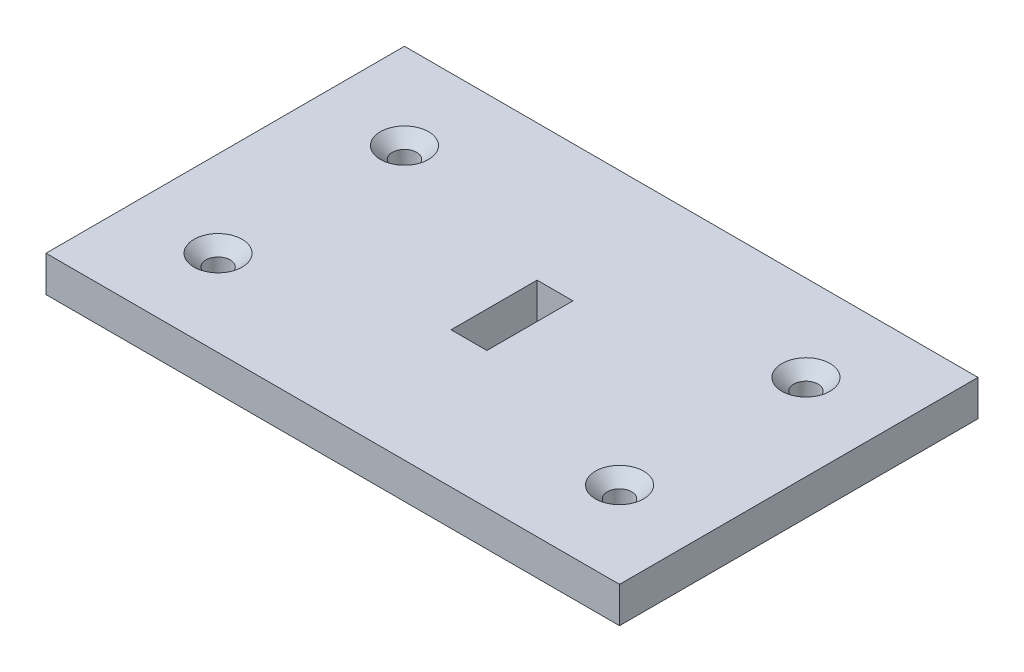
ISO-10303-21;
HEADER;
FILE_DESCRIPTION(('STEP AP214'),'2;1');
FILE_NAME('part.step','',(''),(''),'','','');
FILE_SCHEMA(('AUTOMOTIVE_DESIGN { 1 0 10303 214 1 1 1 1 }'));
ENDSEC;
DATA;
#1=APPLICATION_CONTEXT('core data for automotive mechanical design processes');
#2=APPLICATION_PROTOCOL_DEFINITION('international standard','automotive_design',2000,#1);
#3=PRODUCT_CONTEXT('',#1,'mechanical');
#4=PRODUCT('Part','Part','',(#3));
#5=PRODUCT_RELATED_PRODUCT_CATEGORY('part','',(#4));
#6=PRODUCT_DEFINITION_FORMATION('','',#4);
#7=PRODUCT_DEFINITION_CONTEXT('part definition',#1,'design');
#8=PRODUCT_DEFINITION('design','',#6,#7);
#9=PRODUCT_DEFINITION_SHAPE('','',#8);
#10=(LENGTH_UNIT() NAMED_UNIT(*) SI_UNIT(.MILLI.,.METRE.));
#11=(NAMED_UNIT(*) PLANE_ANGLE_UNIT() SI_UNIT($,.RADIAN.));
#12=(NAMED_UNIT(*) SI_UNIT($,.STERADIAN.) SOLID_ANGLE_UNIT());
#13=UNCERTAINTY_MEASURE_WITH_UNIT(LENGTH_MEASURE(1.E-05),#10,'distance_accuracy_value','');
#14=(GEOMETRIC_REPRESENTATION_CONTEXT(3) GLOBAL_UNCERTAINTY_ASSIGNED_CONTEXT((#13)) GLOBAL_UNIT_ASSIGNED_CONTEXT((#10,
#11,#12)) REPRESENTATION_CONTEXT('',''));
#15=CARTESIAN_POINT('',(0.,0.,0.));
#16=DIRECTION('',(0.,0.,1.));
#17=DIRECTION('',(1.,0.,0.));
#18=AXIS2_PLACEMENT_3D('',#15,#16,#17);
#19=CARTESIAN_POINT('',(40.,2.5,25.));
#20=DIRECTION('',(-1.,0.,0.));
#21=DIRECTION('',(0.,0.,1.));
#22=AXIS2_PLACEMENT_3D('',#19,#20,#21);
#23=PLANE('',#22);
#24=DIRECTION('',(0.,0.,-1.));
#25=VECTOR('',#24,1.);
#26=CARTESIAN_POINT('',(40.,-2.5,25.));
#27=LINE('',#26,#25);
#28=CARTESIAN_POINT('',(40.,-2.5,25.));
#29=VERTEX_POINT('',#28);
#30=CARTESIAN_POINT('',(40.,-2.5,-25.));
#31=VERTEX_POINT('',#30);
#32=EDGE_CURVE('E134',#29,#31,#27,.T.);
#33=ORIENTED_EDGE('',*,*,#32,.T.);
#34=DIRECTION('',(0.,-1.,0.));
#35=VECTOR('',#34,1.);
#36=CARTESIAN_POINT('',(40.,2.5,-25.));
#37=LINE('',#36,#35);
#38=CARTESIAN_POINT('',(40.,2.5,-25.));
#39=VERTEX_POINT('',#38);
#40=EDGE_CURVE('E11',#39,#31,#37,.T.);
#41=ORIENTED_EDGE('',*,*,#40,.F.);
#42=DIRECTION('',(0.,0.,-1.));
#43=VECTOR('',#42,1.);
#44=CARTESIAN_POINT('',(40.,2.5,25.));
#45=LINE('',#44,#43);
#46=CARTESIAN_POINT('',(40.,2.5,25.));
#47=VERTEX_POINT('',#46);
#48=EDGE_CURVE('E138',#47,#39,#45,.T.);
#49=ORIENTED_EDGE('',*,*,#48,.F.);
#50=DIRECTION('',(0.,-1.,0.));
#51=VECTOR('',#50,1.);
#52=CARTESIAN_POINT('',(40.,2.5,25.));
#53=LINE('',#52,#51);
#54=EDGE_CURVE('E150',#47,#29,#53,.T.);
#55=ORIENTED_EDGE('',*,*,#54,.T.);
#56=EDGE_LOOP('',(#33,#41,#49,#55));
#57=FACE_BOUND('',#56,.T.);
#58=ADVANCED_FACE('F34',(#57),#23,.F.);
#59=CARTESIAN_POINT('',(40.,2.5,-25.));
#60=DIRECTION('',(0.,0.,1.));
#61=DIRECTION('',(1.,0.,0.));
#62=AXIS2_PLACEMENT_3D('',#59,#60,#61);
#63=PLANE('',#62);
#64=DIRECTION('',(-1.,0.,0.));
#65=VECTOR('',#64,1.);
#66=CARTESIAN_POINT('',(40.,-2.5,-25.));
#67=LINE('',#66,#65);
#68=CARTESIAN_POINT('',(-40.,-2.5,-25.));
#69=VERTEX_POINT('',#68);
#70=EDGE_CURVE('E153',#31,#69,#67,.T.);
#71=ORIENTED_EDGE('',*,*,#70,.T.);
#72=DIRECTION('',(0.,-1.,0.));
#73=VECTOR('',#72,1.);
#74=CARTESIAN_POINT('',(-40.,2.5,-25.));
#75=LINE('',#74,#73);
#76=CARTESIAN_POINT('',(-40.,2.5,-25.));
#77=VERTEX_POINT('',#76);
#78=EDGE_CURVE('E41',#77,#69,#75,.T.);
#79=ORIENTED_EDGE('',*,*,#78,.F.);
#80=DIRECTION('',(-1.,0.,0.));
#81=VECTOR('',#80,1.);
#82=CARTESIAN_POINT('',(40.,2.5,-25.));
#83=LINE('',#82,#81);
#84=EDGE_CURVE('E141',#39,#77,#83,.T.);
#85=ORIENTED_EDGE('',*,*,#84,.F.);
#86=ORIENTED_EDGE('',*,*,#40,.T.);
#87=EDGE_LOOP('',(#71,#79,#85,#86));
#88=FACE_BOUND('',#87,.T.);
#89=ADVANCED_FACE('F169',(#88),#63,.F.);
#90=CARTESIAN_POINT('',(-40.,2.5,25.));
#91=DIRECTION('',(-1.,0.,0.));
#92=DIRECTION('',(0.,0.,1.));
#93=AXIS2_PLACEMENT_3D('',#90,#91,#92);
#94=PLANE('',#93);
#95=DIRECTION('',(0.,0.,-1.));
#96=VECTOR('',#95,1.);
#97=CARTESIAN_POINT('',(-40.,-2.5,25.));
#98=LINE('',#97,#96);
#99=CARTESIAN_POINT('',(-40.,-2.5,25.));
#100=VERTEX_POINT('',#99);
#101=EDGE_CURVE('E156',#100,#69,#98,.T.);
#102=ORIENTED_EDGE('',*,*,#101,.F.);
#103=DIRECTION('',(0.,-1.,0.));
#104=VECTOR('',#103,1.);
#105=CARTESIAN_POINT('',(-40.,2.5,25.));
#106=LINE('',#105,#104);
#107=CARTESIAN_POINT('',(-40.,2.5,25.));
#108=VERTEX_POINT('',#107);
#109=EDGE_CURVE('E162',#108,#100,#106,.T.);
#110=ORIENTED_EDGE('',*,*,#109,.F.);
#111=DIRECTION('',(0.,0.,-1.));
#112=VECTOR('',#111,1.);
#113=CARTESIAN_POINT('',(-40.,2.5,25.));
#114=LINE('',#113,#112);
#115=EDGE_CURVE('E144',#108,#77,#114,.T.);
#116=ORIENTED_EDGE('',*,*,#115,.T.);
#117=ORIENTED_EDGE('',*,*,#78,.T.);
#118=EDGE_LOOP('',(#102,#110,#116,#117));
#119=FACE_BOUND('',#118,.T.);
#120=ADVANCED_FACE('F166',(#119),#94,.T.);
#121=CARTESIAN_POINT('',(40.,2.5,25.));
#122=DIRECTION('',(0.,0.,1.));
#123=DIRECTION('',(1.,0.,0.));
#124=AXIS2_PLACEMENT_3D('',#121,#122,#123);
#125=PLANE('',#124);
#126=DIRECTION('',(-1.,0.,0.));
#127=VECTOR('',#126,1.);
#128=CARTESIAN_POINT('',(40.,-2.5,25.));
#129=LINE('',#128,#127);
#130=EDGE_CURVE('E142',#29,#100,#129,.T.);
#131=ORIENTED_EDGE('',*,*,#130,.F.);
#132=ORIENTED_EDGE('',*,*,#54,.F.);
#133=DIRECTION('',(-1.,0.,0.));
#134=VECTOR('',#133,1.);
#135=CARTESIAN_POINT('',(40.,2.5,25.));
#136=LINE('',#135,#134);
#137=EDGE_CURVE('E147',#47,#108,#136,.T.);
#138=ORIENTED_EDGE('',*,*,#137,.T.);
#139=ORIENTED_EDGE('',*,*,#109,.T.);
#140=EDGE_LOOP('',(#131,#132,#138,#139));
#141=FACE_BOUND('',#140,.T.);
#142=ADVANCED_FACE('F174',(#141),#125,.T.);
#143=CARTESIAN_POINT('',(0.,2.5,0.));
#144=DIRECTION('',(0.,1.,0.));
#145=DIRECTION('',(0.,0.,1.));
#146=AXIS2_PLACEMENT_3D('',#143,#144,#145);
#147=PLANE('',#146);
#148=CARTESIAN_POINT('',(28.,2.5,13.));
#149=DIRECTION('',(0.,1.,0.));
#150=DIRECTION('',(0.,0.,1.));
#151=AXIS2_PLACEMENT_3D('',#148,#149,#150);
#152=CIRCLE('',#151,3.36);
#153=CARTESIAN_POINT('',(28.,2.5,16.36));
#154=VERTEX_POINT('',#153);
#155=EDGE_CURVE('E247',#154,#154,#152,.T.);
#156=ORIENTED_EDGE('',*,*,#155,.F.);
#157=EDGE_LOOP('',(#156));
#158=FACE_BOUND('',#157,.T.);
#159=CARTESIAN_POINT('',(28.,2.5,-13.));
#160=DIRECTION('',(0.,1.,0.));
#161=DIRECTION('',(0.,0.,1.));
#162=AXIS2_PLACEMENT_3D('',#159,#160,#161);
#163=CIRCLE('',#162,3.36);
#164=CARTESIAN_POINT('',(28.,2.5,-9.64));
#165=VERTEX_POINT('',#164);
#166=EDGE_CURVE('E254',#165,#165,#163,.T.);
#167=ORIENTED_EDGE('',*,*,#166,.F.);
#168=EDGE_LOOP('',(#167));
#169=FACE_BOUND('',#168,.T.);
#170=CARTESIAN_POINT('',(-28.,2.5,13.));
#171=DIRECTION('',(0.,1.,0.));
#172=DIRECTION('',(0.,0.,1.));
#173=AXIS2_PLACEMENT_3D('',#170,#171,#172);
#174=CIRCLE('',#173,3.36);
#175=CARTESIAN_POINT('',(-28.,2.5,16.36));
#176=VERTEX_POINT('',#175);
#177=EDGE_CURVE('E263',#176,#176,#174,.T.);
#178=ORIENTED_EDGE('',*,*,#177,.F.);
#179=EDGE_LOOP('',(#178));
#180=FACE_BOUND('',#179,.T.);
#181=CARTESIAN_POINT('',(-28.,2.5,-13.));
#182=DIRECTION('',(0.,1.,0.));
#183=DIRECTION('',(0.,0.,1.));
#184=AXIS2_PLACEMENT_3D('',#181,#182,#183);
#185=CIRCLE('',#184,3.36);
#186=CARTESIAN_POINT('',(-28.,2.5,-9.64));
#187=VERTEX_POINT('',#186);
#188=EDGE_CURVE('E272',#187,#187,#185,.T.);
#189=ORIENTED_EDGE('',*,*,#188,.F.);
#190=EDGE_LOOP('',(#189));
#191=FACE_BOUND('',#190,.T.);
#192=DIRECTION('',(0.,0.,1.));
#193=VECTOR('',#192,1.);
#194=CARTESIAN_POINT('',(-2.5,2.5,6.));
#195=LINE('',#194,#193);
#196=CARTESIAN_POINT('',(-2.5,2.5,-6.));
#197=VERTEX_POINT('',#196);
#198=CARTESIAN_POINT('',(-2.5,2.5,6.));
#199=VERTEX_POINT('',#198);
#200=EDGE_CURVE('E48',#197,#199,#195,.T.);
#201=ORIENTED_EDGE('',*,*,#200,.F.);
#202=DIRECTION('',(-1.,0.,0.));
#203=VECTOR('',#202,1.);
#204=CARTESIAN_POINT('',(2.5,2.5,-6.));
#205=LINE('',#204,#203);
#206=CARTESIAN_POINT('',(2.5,2.5,-6.));
#207=VERTEX_POINT('',#206);
#208=EDGE_CURVE('E116',#207,#197,#205,.T.);
#209=ORIENTED_EDGE('',*,*,#208,.F.);
#210=DIRECTION('',(0.,0.,-1.));
#211=VECTOR('',#210,1.);
#212=CARTESIAN_POINT('',(2.5,2.5,6.));
#213=LINE('',#212,#211);
#214=CARTESIAN_POINT('',(2.5,2.5,6.));
#215=VERTEX_POINT('',#214);
#216=EDGE_CURVE('E119',#215,#207,#213,.T.);
#217=ORIENTED_EDGE('',*,*,#216,.F.);
#218=DIRECTION('',(1.,0.,0.));
#219=VECTOR('',#218,1.);
#220=CARTESIAN_POINT('',(2.5,2.5,6.));
#221=LINE('',#220,#219);
#222=EDGE_CURVE('E128',#199,#215,#221,.T.);
#223=ORIENTED_EDGE('',*,*,#222,.F.);
#224=EDGE_LOOP('',(#201,#209,#217,#223));
#225=FACE_BOUND('',#224,.T.);
#226=ORIENTED_EDGE('',*,*,#48,.T.);
#227=ORIENTED_EDGE('',*,*,#84,.T.);
#228=ORIENTED_EDGE('',*,*,#115,.F.);
#229=ORIENTED_EDGE('',*,*,#137,.F.);
#230=EDGE_LOOP('',(#226,#227,#228,#229));
#231=FACE_BOUND('',#230,.T.);
#232=ADVANCED_FACE('F178',(#158,#169,#180,#191,#225,#231),#147,.T.);
#233=CARTESIAN_POINT('',(0.,-2.5,0.));
#234=DIRECTION('',(0.,1.,0.));
#235=DIRECTION('',(0.,0.,1.));
#236=AXIS2_PLACEMENT_3D('',#233,#234,#235);
#237=PLANE('',#236);
#238=CARTESIAN_POINT('',(28.,-2.5,13.));
#239=DIRECTION('',(0.,1.,0.));
#240=DIRECTION('',(0.,0.,1.));
#241=AXIS2_PLACEMENT_3D('',#238,#239,#240);
#242=CIRCLE('',#241,1.7);
#243=CARTESIAN_POINT('',(28.,-2.5,14.7));
#244=VERTEX_POINT('',#243);
#245=EDGE_CURVE('E249',#244,#244,#242,.T.);
#246=ORIENTED_EDGE('',*,*,#245,.T.);
#247=EDGE_LOOP('',(#246));
#248=FACE_BOUND('',#247,.T.);
#249=CARTESIAN_POINT('',(28.,-2.5,-13.));
#250=DIRECTION('',(0.,1.,0.));
#251=DIRECTION('',(0.,0.,1.));
#252=AXIS2_PLACEMENT_3D('',#249,#250,#251);
#253=CIRCLE('',#252,1.7);
#254=CARTESIAN_POINT('',(28.,-2.5,-11.3));
#255=VERTEX_POINT('',#254);
#256=EDGE_CURVE('E260',#255,#255,#253,.T.);
#257=ORIENTED_EDGE('',*,*,#256,.T.);
#258=EDGE_LOOP('',(#257));
#259=FACE_BOUND('',#258,.T.);
#260=CARTESIAN_POINT('',(-28.,-2.5,13.));
#261=DIRECTION('',(0.,1.,0.));
#262=DIRECTION('',(0.,0.,1.));
#263=AXIS2_PLACEMENT_3D('',#260,#261,#262);
#264=CIRCLE('',#263,1.7);
#265=CARTESIAN_POINT('',(-28.,-2.5,14.7));
#266=VERTEX_POINT('',#265);
#267=EDGE_CURVE('E269',#266,#266,#264,.T.);
#268=ORIENTED_EDGE('',*,*,#267,.T.);
#269=EDGE_LOOP('',(#268));
#270=FACE_BOUND('',#269,.T.);
#271=CARTESIAN_POINT('',(-28.,-2.5,-13.));
#272=DIRECTION('',(0.,1.,0.));
#273=DIRECTION('',(0.,0.,1.));
#274=AXIS2_PLACEMENT_3D('',#271,#272,#273);
#275=CIRCLE('',#274,1.7);
#276=CARTESIAN_POINT('',(-28.,-2.5,-11.3));
#277=VERTEX_POINT('',#276);
#278=EDGE_CURVE('E122',#277,#277,#275,.T.);
#279=ORIENTED_EDGE('',*,*,#278,.T.);
#280=EDGE_LOOP('',(#279));
#281=FACE_BOUND('',#280,.T.);
#282=DIRECTION('',(-1.,0.,0.));
#283=VECTOR('',#282,1.);
#284=CARTESIAN_POINT('',(2.5,-2.5,-6.));
#285=LINE('',#284,#283);
#286=CARTESIAN_POINT('',(2.5,-2.5,-6.));
#287=VERTEX_POINT('',#286);
#288=CARTESIAN_POINT('',(-2.5,-2.5,-6.));
#289=VERTEX_POINT('',#288);
#290=EDGE_CURVE('E106',#287,#289,#285,.T.);
#291=ORIENTED_EDGE('',*,*,#290,.T.);
#292=DIRECTION('',(0.,0.,1.));
#293=VECTOR('',#292,1.);
#294=CARTESIAN_POINT('',(-2.5,-2.5,6.));
#295=LINE('',#294,#293);
#296=CARTESIAN_POINT('',(-2.5,-2.5,6.));
#297=VERTEX_POINT('',#296);
#298=EDGE_CURVE('E100',#289,#297,#295,.T.);
#299=ORIENTED_EDGE('',*,*,#298,.T.);
#300=DIRECTION('',(1.,0.,0.));
#301=VECTOR('',#300,1.);
#302=CARTESIAN_POINT('',(2.5,-2.5,6.));
#303=LINE('',#302,#301);
#304=CARTESIAN_POINT('',(2.5,-2.5,6.));
#305=VERTEX_POINT('',#304);
#306=EDGE_CURVE('E109',#297,#305,#303,.T.);
#307=ORIENTED_EDGE('',*,*,#306,.T.);
#308=DIRECTION('',(0.,0.,-1.));
#309=VECTOR('',#308,1.);
#310=CARTESIAN_POINT('',(2.5,-2.5,6.));
#311=LINE('',#310,#309);
#312=EDGE_CURVE('E56',#305,#287,#311,.T.);
#313=ORIENTED_EDGE('',*,*,#312,.T.);
#314=EDGE_LOOP('',(#291,#299,#307,#313));
#315=FACE_BOUND('',#314,.T.);
#316=ORIENTED_EDGE('',*,*,#32,.F.);
#317=ORIENTED_EDGE('',*,*,#130,.T.);
#318=ORIENTED_EDGE('',*,*,#101,.T.);
#319=ORIENTED_EDGE('',*,*,#70,.F.);
#320=EDGE_LOOP('',(#316,#317,#318,#319));
#321=FACE_BOUND('',#320,.T.);
#322=ADVANCED_FACE('F113',(#248,#259,#270,#281,#315,#321),#237,.F.);
#323=CARTESIAN_POINT('',(-2.5,-2.5,6.));
#324=DIRECTION('',(-1.,0.,0.));
#325=DIRECTION('',(0.,0.,1.));
#326=AXIS2_PLACEMENT_3D('',#323,#324,#325);
#327=PLANE('',#326);
#328=ORIENTED_EDGE('',*,*,#200,.T.);
#329=DIRECTION('',(0.,1.,0.));
#330=VECTOR('',#329,1.);
#331=CARTESIAN_POINT('',(-2.5,-2.5,6.));
#332=LINE('',#331,#330);
#333=EDGE_CURVE('E96',#297,#199,#332,.T.);
#334=ORIENTED_EDGE('',*,*,#333,.F.);
#335=ORIENTED_EDGE('',*,*,#298,.F.);
#336=DIRECTION('',(0.,1.,0.));
#337=VECTOR('',#336,1.);
#338=CARTESIAN_POINT('',(-2.5,-2.5,-6.));
#339=LINE('',#338,#337);
#340=EDGE_CURVE('E132',#289,#197,#339,.T.);
#341=ORIENTED_EDGE('',*,*,#340,.T.);
#342=EDGE_LOOP('',(#328,#334,#335,#341));
#343=FACE_BOUND('',#342,.T.);
#344=ADVANCED_FACE('F98',(#343),#327,.F.);
#345=CARTESIAN_POINT('',(2.5,-2.5,-6.));
#346=DIRECTION('',(0.,0.,-1.));
#347=DIRECTION('',(-1.,0.,0.));
#348=AXIS2_PLACEMENT_3D('',#345,#346,#347);
#349=PLANE('',#348);
#350=ORIENTED_EDGE('',*,*,#208,.T.);
#351=ORIENTED_EDGE('',*,*,#340,.F.);
#352=ORIENTED_EDGE('',*,*,#290,.F.);
#353=DIRECTION('',(0.,1.,0.));
#354=VECTOR('',#353,1.);
#355=CARTESIAN_POINT('',(2.5,-2.5,-6.));
#356=LINE('',#355,#354);
#357=EDGE_CURVE('E135',#287,#207,#356,.T.);
#358=ORIENTED_EDGE('',*,*,#357,.T.);
#359=EDGE_LOOP('',(#350,#351,#352,#358));
#360=FACE_BOUND('',#359,.T.);
#361=ADVANCED_FACE('F199',(#360),#349,.F.);
#362=CARTESIAN_POINT('',(2.5,-2.5,6.));
#363=DIRECTION('',(1.,0.,0.));
#364=DIRECTION('',(0.,0.,-1.));
#365=AXIS2_PLACEMENT_3D('',#362,#363,#364);
#366=PLANE('',#365);
#367=ORIENTED_EDGE('',*,*,#216,.T.);
#368=ORIENTED_EDGE('',*,*,#357,.F.);
#369=ORIENTED_EDGE('',*,*,#312,.F.);
#370=DIRECTION('',(0.,1.,0.));
#371=VECTOR('',#370,1.);
#372=CARTESIAN_POINT('',(2.5,-2.5,6.));
#373=LINE('',#372,#371);
#374=EDGE_CURVE('E105',#305,#215,#373,.T.);
#375=ORIENTED_EDGE('',*,*,#374,.T.);
#376=EDGE_LOOP('',(#367,#368,#369,#375));
#377=FACE_BOUND('',#376,.T.);
#378=ADVANCED_FACE('F203',(#377),#366,.F.);
#379=CARTESIAN_POINT('',(2.5,-2.5,6.));
#380=DIRECTION('',(0.,0.,1.));
#381=DIRECTION('',(1.,0.,0.));
#382=AXIS2_PLACEMENT_3D('',#379,#380,#381);
#383=PLANE('',#382);
#384=ORIENTED_EDGE('',*,*,#222,.T.);
#385=ORIENTED_EDGE('',*,*,#374,.F.);
#386=ORIENTED_EDGE('',*,*,#306,.F.);
#387=ORIENTED_EDGE('',*,*,#333,.T.);
#388=EDGE_LOOP('',(#384,#385,#386,#387));
#389=FACE_BOUND('',#388,.T.);
#390=ADVANCED_FACE('F110',(#389),#383,.F.);
#391=CARTESIAN_POINT('',(-28.,2.5,-13.));
#392=DIRECTION('',(0.,1.,0.));
#393=DIRECTION('',(0.,0.,1.));
#394=AXIS2_PLACEMENT_3D('',#391,#392,#393);
#395=CYLINDRICAL_SURFACE('',#394,1.7);
#396=ORIENTED_EDGE('',*,*,#278,.F.);
#397=EDGE_LOOP('',(#396));
#398=FACE_BOUND('',#397,.T.);
#399=CARTESIAN_POINT('',(-28.,0.84,-13.));
#400=DIRECTION('',(0.,1.,0.));
#401=DIRECTION('',(0.,0.,1.));
#402=AXIS2_PLACEMENT_3D('',#399,#400,#401);
#403=CIRCLE('',#402,1.7);
#404=CARTESIAN_POINT('',(-28.,0.84,-11.3));
#405=VERTEX_POINT('',#404);
#406=EDGE_CURVE('E274',#405,#405,#403,.T.);
#407=ORIENTED_EDGE('',*,*,#406,.T.);
#408=EDGE_LOOP('',(#407));
#409=FACE_BOUND('',#408,.T.);
#410=ADVANCED_FACE('F202',(#398,#409),#395,.F.);
#411=CARTESIAN_POINT('',(-28.,2.5,-13.));
#412=DIRECTION('',(0.,1.,0.));
#413=DIRECTION('',(0.,0.,1.));
#414=AXIS2_PLACEMENT_3D('',#411,#412,#413);
#415=CONICAL_SURFACE('',#414,3.36,0.785398163397448);
#416=ORIENTED_EDGE('',*,*,#406,.F.);
#417=EDGE_LOOP('',(#416));
#418=FACE_BOUND('',#417,.T.);
#419=ORIENTED_EDGE('',*,*,#188,.T.);
#420=EDGE_LOOP('',(#419));
#421=FACE_BOUND('',#420,.T.);
#422=ADVANCED_FACE('F211',(#418,#421),#415,.F.);
#423=CARTESIAN_POINT('',(-28.,2.5,13.));
#424=DIRECTION('',(0.,1.,0.));
#425=DIRECTION('',(0.,0.,1.));
#426=AXIS2_PLACEMENT_3D('',#423,#424,#425);
#427=CYLINDRICAL_SURFACE('',#426,1.7);
#428=ORIENTED_EDGE('',*,*,#267,.F.);
#429=EDGE_LOOP('',(#428));
#430=FACE_BOUND('',#429,.T.);
#431=CARTESIAN_POINT('',(-28.,0.84,13.));
#432=DIRECTION('',(0.,1.,0.));
#433=DIRECTION('',(0.,0.,1.));
#434=AXIS2_PLACEMENT_3D('',#431,#432,#433);
#435=CIRCLE('',#434,1.7);
#436=CARTESIAN_POINT('',(-28.,0.84,14.7));
#437=VERTEX_POINT('',#436);
#438=EDGE_CURVE('E266',#437,#437,#435,.T.);
#439=ORIENTED_EDGE('',*,*,#438,.T.);
#440=EDGE_LOOP('',(#439));
#441=FACE_BOUND('',#440,.T.);
#442=ADVANCED_FACE('F215',(#430,#441),#427,.F.);
#443=CARTESIAN_POINT('',(-28.,2.5,13.));
#444=DIRECTION('',(0.,1.,0.));
#445=DIRECTION('',(0.,0.,1.));
#446=AXIS2_PLACEMENT_3D('',#443,#444,#445);
#447=CONICAL_SURFACE('',#446,3.36,0.785398163397448);
#448=ORIENTED_EDGE('',*,*,#438,.F.);
#449=EDGE_LOOP('',(#448));
#450=FACE_BOUND('',#449,.T.);
#451=ORIENTED_EDGE('',*,*,#177,.T.);
#452=EDGE_LOOP('',(#451));
#453=FACE_BOUND('',#452,.T.);
#454=ADVANCED_FACE('F219',(#450,#453),#447,.F.);
#455=CARTESIAN_POINT('',(28.,2.5,-13.));
#456=DIRECTION('',(0.,1.,0.));
#457=DIRECTION('',(0.,0.,1.));
#458=AXIS2_PLACEMENT_3D('',#455,#456,#457);
#459=CYLINDRICAL_SURFACE('',#458,1.7);
#460=ORIENTED_EDGE('',*,*,#256,.F.);
#461=EDGE_LOOP('',(#460));
#462=FACE_BOUND('',#461,.T.);
#463=CARTESIAN_POINT('',(28.,0.84,-13.));
#464=DIRECTION('',(0.,1.,0.));
#465=DIRECTION('',(0.,0.,1.));
#466=AXIS2_PLACEMENT_3D('',#463,#464,#465);
#467=CIRCLE('',#466,1.7);
#468=CARTESIAN_POINT('',(28.,0.84,-11.3));
#469=VERTEX_POINT('',#468);
#470=EDGE_CURVE('E257',#469,#469,#467,.T.);
#471=ORIENTED_EDGE('',*,*,#470,.T.);
#472=EDGE_LOOP('',(#471));
#473=FACE_BOUND('',#472,.T.);
#474=ADVANCED_FACE('F223',(#462,#473),#459,.F.);
#475=CARTESIAN_POINT('',(28.,2.5,-13.));
#476=DIRECTION('',(0.,1.,0.));
#477=DIRECTION('',(0.,0.,1.));
#478=AXIS2_PLACEMENT_3D('',#475,#476,#477);
#479=CONICAL_SURFACE('',#478,3.36,0.785398163397448);
#480=ORIENTED_EDGE('',*,*,#470,.F.);
#481=EDGE_LOOP('',(#480));
#482=FACE_BOUND('',#481,.T.);
#483=ORIENTED_EDGE('',*,*,#166,.T.);
#484=EDGE_LOOP('',(#483));
#485=FACE_BOUND('',#484,.T.);
#486=ADVANCED_FACE('F227',(#482,#485),#479,.F.);
#487=CARTESIAN_POINT('',(28.,2.5,13.));
#488=DIRECTION('',(0.,1.,0.));
#489=DIRECTION('',(0.,0.,1.));
#490=AXIS2_PLACEMENT_3D('',#487,#488,#489);
#491=CYLINDRICAL_SURFACE('',#490,1.7);
#492=ORIENTED_EDGE('',*,*,#245,.F.);
#493=EDGE_LOOP('',(#492));
#494=FACE_BOUND('',#493,.T.);
#495=CARTESIAN_POINT('',(28.,0.84,13.));
#496=DIRECTION('',(0.,1.,0.));
#497=DIRECTION('',(0.,0.,1.));
#498=AXIS2_PLACEMENT_3D('',#495,#496,#497);
#499=CIRCLE('',#498,1.7);
#500=CARTESIAN_POINT('',(28.,0.84,14.7));
#501=VERTEX_POINT('',#500);
#502=EDGE_CURVE('E244',#501,#501,#499,.T.);
#503=ORIENTED_EDGE('',*,*,#502,.T.);
#504=EDGE_LOOP('',(#503));
#505=FACE_BOUND('',#504,.T.);
#506=ADVANCED_FACE('F231',(#494,#505),#491,.F.);
#507=CARTESIAN_POINT('',(28.,2.5,13.));
#508=DIRECTION('',(0.,1.,0.));
#509=DIRECTION('',(0.,0.,1.));
#510=AXIS2_PLACEMENT_3D('',#507,#508,#509);
#511=CONICAL_SURFACE('',#510,3.36,0.785398163397448);
#512=ORIENTED_EDGE('',*,*,#502,.F.);
#513=EDGE_LOOP('',(#512));
#514=FACE_BOUND('',#513,.T.);
#515=ORIENTED_EDGE('',*,*,#155,.T.);
#516=EDGE_LOOP('',(#515));
#517=FACE_BOUND('',#516,.T.);
#518=ADVANCED_FACE('F235',(#514,#517),#511,.F.);
#519=CLOSED_SHELL('',(#58,#89,#120,#142,#232,#322,#344,#361,#378,#390,#410,#422,#442,#454,#474,
#486,#506,#518));
#520=MANIFOLD_SOLID_BREP('B2',#519);
#521=ADVANCED_BREP_SHAPE_REPRESENTATION('',(#18,#520),#14);
#522=SHAPE_DEFINITION_REPRESENTATION(#9,#521);
ENDSEC;
END-ISO-10303-21;
